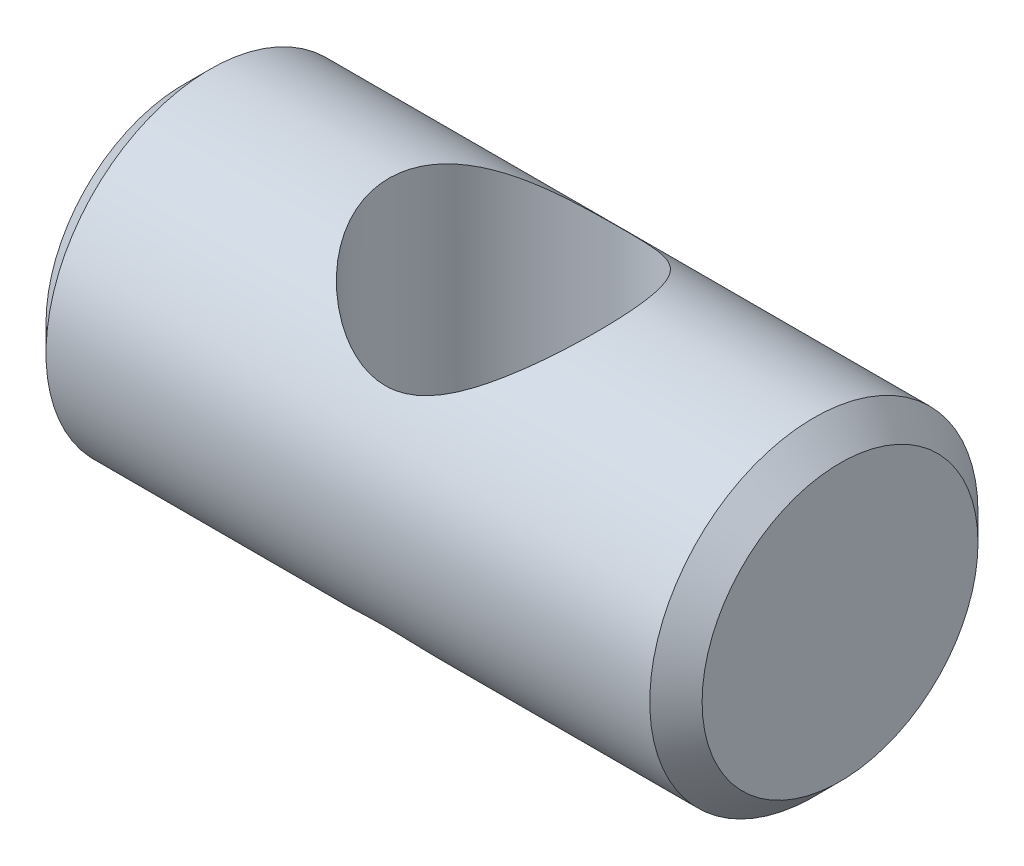
ISO-10303-21;
HEADER;
FILE_DESCRIPTION(('STEP AP214'),'2;1');
FILE_NAME('part.step','',(''),(''),'','','');
FILE_SCHEMA(('AUTOMOTIVE_DESIGN { 1 0 10303 214 1 1 1 1 }'));
ENDSEC;
DATA;
#1=APPLICATION_CONTEXT('core data for automotive mechanical design processes');
#2=APPLICATION_PROTOCOL_DEFINITION('international standard','automotive_design',2000,#1);
#3=PRODUCT_CONTEXT('',#1,'mechanical');
#4=PRODUCT('Part','Part','',(#3));
#5=PRODUCT_RELATED_PRODUCT_CATEGORY('part','',(#4));
#6=PRODUCT_DEFINITION_FORMATION('','',#4);
#7=PRODUCT_DEFINITION_CONTEXT('part definition',#1,'design');
#8=PRODUCT_DEFINITION('design','',#6,#7);
#9=PRODUCT_DEFINITION_SHAPE('','',#8);
#10=(LENGTH_UNIT() NAMED_UNIT(*) SI_UNIT(.MILLI.,.METRE.));
#11=(NAMED_UNIT(*) PLANE_ANGLE_UNIT() SI_UNIT($,.RADIAN.));
#12=(NAMED_UNIT(*) SI_UNIT($,.STERADIAN.) SOLID_ANGLE_UNIT());
#13=UNCERTAINTY_MEASURE_WITH_UNIT(LENGTH_MEASURE(1.E-05),#10,'distance_accuracy_value','');
#14=(GEOMETRIC_REPRESENTATION_CONTEXT(3) GLOBAL_UNCERTAINTY_ASSIGNED_CONTEXT((#13)) GLOBAL_UNIT_ASSIGNED_CONTEXT((#10,
#11,#12)) REPRESENTATION_CONTEXT('',''));
#15=CARTESIAN_POINT('',(0.,0.,0.));
#16=DIRECTION('',(0.,0.,1.));
#17=DIRECTION('',(1.,0.,0.));
#18=AXIS2_PLACEMENT_3D('',#15,#16,#17);
#19=CARTESIAN_POINT('',(9.525,0.,0.));
#20=DIRECTION('',(-1.,0.,0.));
#21=DIRECTION('',(0.,0.,1.));
#22=AXIS2_PLACEMENT_3D('',#19,#20,#21);
#23=CYLINDRICAL_SURFACE('',#22,4.765);
#24=CARTESIAN_POINT('',(0.,-3.0270158572429,3.68));
#25=CARTESIAN_POINT('',(0.0785672773316467,-3.02701614791727,3.67999984364138));
#26=CARTESIAN_POINT('',(0.157136135576355,-3.03031605642996,3.67729277636747));
#27=CARTESIAN_POINT('',(0.313369541449519,-3.04330147157753,3.66655295600809));
#28=CARTESIAN_POINT('',(0.391034010912772,-3.05298752605126,3.65851974601636));
#29=CARTESIAN_POINT('',(0.544942339151607,-3.07820352988238,3.63732812874269));
#30=CARTESIAN_POINT('',(0.621180877977563,-3.09375201630091,3.62415345944192));
#31=CARTESIAN_POINT('',(0.771468880528868,-3.12988210454059,3.59299821855179));
#32=CARTESIAN_POINT('',(0.845516665983408,-3.15046745848851,3.57501406328682));
#33=CARTESIAN_POINT('',(1.09433047382612,-3.22791462831319,3.50587087765695));
#34=CARTESIAN_POINT('',(1.26309282362243,-3.29483865802861,3.44382003292069));
#35=CARTESIAN_POINT('',(1.50370711041474,-3.40467601246938,3.33408533723918));
#36=CARTESIAN_POINT('',(1.58189244838755,-3.44290479326835,3.29468500807197));
#37=CARTESIAN_POINT('',(1.73423285237258,-3.52148653298939,3.21055545325705));
#38=CARTESIAN_POINT('',(1.80838881793449,-3.56183901380659,3.16582742418489));
#39=CARTESIAN_POINT('',(2.02850482582812,-3.68672600847629,3.02153691887044));
#40=CARTESIAN_POINT('',(2.16807869449588,-3.77315168849593,2.91372187409719));
#41=CARTESIAN_POINT('',(2.42959010373284,-3.94426933228633,2.67754924945123));
#42=CARTESIAN_POINT('',(2.55153658554773,-4.02896215617591,2.54920215427041));
#43=CARTESIAN_POINT('',(2.77693730786715,-4.19195052141121,2.27132648174837));
#44=CARTESIAN_POINT('',(2.88023478105728,-4.27018907543985,2.12163570850645));
#45=CARTESIAN_POINT('',(3.06369900830999,-4.41409842691617,1.80316374111448));
#46=CARTESIAN_POINT('',(3.14388622560065,-4.47978032533083,1.63439962117957));
#47=CARTESIAN_POINT('',(3.26635689009236,-4.58439476517905,1.30881127520956));
#48=CARTESIAN_POINT('',(3.3126324755552,-4.62591646772975,1.15433056577145));
#49=CARTESIAN_POINT('',(3.38325654959983,-4.69367027218436,0.83720228083025));
#50=CARTESIAN_POINT('',(3.40762001451853,-4.7199128126465,0.674560363681938));
#51=CARTESIAN_POINT('',(3.43267527752513,-4.75538994748078,0.345016918949483));
#52=CARTESIAN_POINT('',(3.43328564995364,-4.76456593536209,0.178102701594283));
#53=CARTESIAN_POINT('',(3.41018166140548,-4.76540378920208,-0.15408080850447));
#54=CARTESIAN_POINT('',(3.38646547727926,-4.75706434242047,-0.319349977022775));
#55=CARTESIAN_POINT('',(3.31775156953333,-4.72510260499364,-0.634317782486348));
#56=CARTESIAN_POINT('',(3.27397352746067,-4.70233080305011,-0.784375176401479));
#57=CARTESIAN_POINT('',(3.16750864597913,-4.64450941494238,-1.07505429218324));
#58=CARTESIAN_POINT('',(3.10481828431147,-4.60945754152293,-1.21567425043884));
#59=CARTESIAN_POINT('',(2.95652856255593,-4.52638674091888,-1.49677788855974));
#60=CARTESIAN_POINT('',(2.86942133720827,-4.47751111873768,-1.63620711351602));
#61=CARTESIAN_POINT('',(2.67788120319372,-4.37232420780869,-1.89951272145432));
#62=CARTESIAN_POINT('',(2.57343424063936,-4.31600689517522,-2.02337634423389));
#63=CARTESIAN_POINT('',(2.3299298971412,-4.18996971318213,-2.27426780979749));
#64=CARTESIAN_POINT('',(2.18800876851398,-4.11960732735628,-2.39819784816123));
#65=CARTESIAN_POINT('',(1.88505782163776,-3.98107848473248,-2.62174133186739));
#66=CARTESIAN_POINT('',(1.72402241690679,-3.91291267736107,-2.72134764203992));
#67=CARTESIAN_POINT('',(1.40961518716303,-3.79636450990898,-2.881168849186));
#68=CARTESIAN_POINT('',(1.25863725138285,-3.74654731116981,-2.94503209171547));
#69=CARTESIAN_POINT('',(0.945527440392473,-3.66060402226399,-3.05121747931762));
#70=CARTESIAN_POINT('',(0.783414037013451,-3.62445587601066,-3.09357436476774));
#71=CARTESIAN_POINT('',(0.533813056438611,-3.58476149841442,-3.13928376884266));
#72=CARTESIAN_POINT('',(0.449028547115522,-3.57393161480045,-3.15156761613341));
#73=CARTESIAN_POINT('',(0.278275024285709,-3.55780077117141,-3.16976872881678));
#74=CARTESIAN_POINT('',(0.192306660171831,-3.5524968934398,-3.17568935402606));
#75=CARTESIAN_POINT('',(0.0200327709043111,-3.54772147962291,-3.18102355866001));
#76=CARTESIAN_POINT('',(-0.0662726316081485,-3.54824798964232,-3.18043931801256));
#77=CARTESIAN_POINT('',(-0.238338872801629,-3.55508375410915,-3.17279435887041));
#78=CARTESIAN_POINT('',(-0.324099748085627,-3.56139261563451,-3.16573408043507));
#79=CARTESIAN_POINT('',(-0.553401842306177,-3.58576306843395,-3.13816835119393));
#80=CARTESIAN_POINT('',(-0.695739197403444,-3.60894237647337,-3.11173256017326));
#81=CARTESIAN_POINT('',(-0.973480788870411,-3.6678298405413,-3.04208625520151));
#82=CARTESIAN_POINT('',(-1.10887734054378,-3.70355155394913,-2.99885758403296));
#83=CARTESIAN_POINT('',(-1.42379146726814,-3.7997001514418,-2.87675019956371));
#84=CARTESIAN_POINT('',(-1.59919673865542,-3.86428769996493,-2.79052654374781));
#85=CARTESIAN_POINT('',(-1.93113815119942,-4.00059813210694,-2.59133845951309));
#86=CARTESIAN_POINT('',(-2.08764088718698,-4.07233325050109,-2.47832770642991));
#87=CARTESIAN_POINT('',(-2.38199709911893,-4.21579037939226,-2.22570370446708));
#88=CARTESIAN_POINT('',(-2.51955338419097,-4.28749766673045,-2.08573466326166));
#89=CARTESIAN_POINT('',(-2.77028243502778,-4.42234806198233,-1.78201502187867));
#90=CARTESIAN_POINT('',(-2.88349257282064,-4.48550424008068,-1.61830152645775));
#91=CARTESIAN_POINT('',(-3.06402610957439,-4.58658548395503,-1.30045140866569));
#92=CARTESIAN_POINT('',(-3.13591982023922,-4.62699541781642,-1.14970877890861));
#93=CARTESIAN_POINT('',(-3.25766051296821,-4.69370617156705,-0.836599849304391));
#94=CARTESIAN_POINT('',(-3.30752205037566,-4.7200163088041,-0.674241306034808));
#95=CARTESIAN_POINT('',(-3.3829870904449,-4.75572615385405,-0.341241432427484));
#96=CARTESIAN_POINT('',(-3.40846923089666,-4.7650414665297,-0.170563063438746));
#97=CARTESIAN_POINT('',(-3.4334390909829,-4.76495829995348,0.172677006169806));
#98=CARTESIAN_POINT('',(-3.43293306367628,-4.7555643228997,0.345238243758834));
#99=CARTESIAN_POINT('',(-3.40754400048731,-4.71998636563285,0.672126495727839));
#100=CARTESIAN_POINT('',(-3.38468468821344,-4.69525837988108,0.82677947345949));
#101=CARTESIAN_POINT('',(-3.31910619707247,-4.63193340521078,1.12882616508402));
#102=CARTESIAN_POINT('',(-3.27638180384756,-4.59333277548538,1.27621796175837));
#103=CARTESIAN_POINT('',(-3.17042951924722,-4.50215126554465,1.56862605724139));
#104=CARTESIAN_POINT('',(-3.10621371599284,-4.44892473542071,1.71307815224114));
#105=CARTESIAN_POINT('',(-2.96073945861412,-4.33272638873523,1.98874620073681));
#106=CARTESIAN_POINT('',(-2.87947919610232,-4.26975353829207,2.11996074756245));
#107=CARTESIAN_POINT('',(-2.68651050838254,-4.12556821291774,2.39003735747662));
#108=CARTESIAN_POINT('',(-2.57196063848181,-4.04309554925752,2.52618739114482));
#109=CARTESIAN_POINT('',(-2.32447412944917,-3.87408431941462,2.77844859407009));
#110=CARTESIAN_POINT('',(-2.19149095139184,-3.78753584009049,2.89450731580784));
#111=CARTESIAN_POINT('',(-1.96595276183287,-3.65130486353125,3.06263487303052));
#112=CARTESIAN_POINT('',(-1.87886470860019,-3.60090149373494,3.12157066922301));
#113=CARTESIAN_POINT('',(-1.69862262017005,-3.50236607543005,3.23173475735497));
#114=CARTESIAN_POINT('',(-1.60546616441238,-3.45423494663789,3.28295994638551));
#115=CARTESIAN_POINT('',(-1.41335402823624,-3.36225362869259,3.37709887635029));
#116=CARTESIAN_POINT('',(-1.31441341048655,-3.31839304937429,3.4200330530899));
#117=CARTESIAN_POINT('',(-1.11061583662532,-3.23713845030014,3.49704051581634));
#118=CARTESIAN_POINT('',(-1.00576424358737,-3.19973868995705,3.53112168161428));
#119=CARTESIAN_POINT('',(-0.826860618617421,-3.1451674862639,3.57966454279998));
#120=CARTESIAN_POINT('',(-0.754330914941616,-3.12542579098052,3.59686794878708));
#121=CARTESIAN_POINT('',(-0.607204587985837,-3.09080711138969,3.62665947956898));
#122=CARTESIAN_POINT('',(-0.532609008476299,-3.07592771737776,3.63924989089071));
#123=CARTESIAN_POINT('',(-0.382096659839412,-3.05181598122002,3.65949364139542));
#124=CARTESIAN_POINT('',(-0.306185151895194,-3.04256489437812,3.66716337327478));
#125=CARTESIAN_POINT('',(-0.153516252829605,-3.03016475948479,3.67741657137031));
#126=CARTESIAN_POINT('',(-0.0767588809019638,-3.02701557325904,3.68000015275969));
#127=CARTESIAN_POINT('',(0.,-3.0270158572429,3.68));
#128=B_SPLINE_CURVE_WITH_KNOTS('',3,(#24,#25,#26,#27,#28,#29,#30,#31,#32,#33,#34,#35,#36,#37,
#38,#39,#40,#41,#42,#43,#44,#45,#46,#47,#48,#49,#50,#51,#52,#53,#54,#55,#56,#57,#58,#59,#60,#61,
#62,#63,#64,#65,#66,#67,#68,#69,#70,#71,#72,#73,#74,#75,#76,#77,#78,#79,#80,#81,#82,#83,#84,#85,
#86,#87,#88,#89,#90,#91,#92,#93,#94,#95,#96,#97,#98,#99,#100,#101,#102,#103,#104,#105,#106,#107,
#108,#109,#110,#111,#112,#113,#114,#115,#116,#117,#118,#119,#120,#121,#122,#123,#124,#125,#126,
#127),.UNSPECIFIED.,.T.,.F.,(4,2,2,2,2,2,2,2,2,2,2,2,2,2,2,2,2,2,2,2,2,2,2,2,2,2,2,2,2,2,2,2,2,
2,2,2,2,2,2,2,2,2,2,2,2,2,2,2,2,2,2,4),(0.,0.235591708988227,0.471203630963839,
0.707566894291257,0.944106771258298,1.51591397043088,1.80236618274397,2.08875418016066,
2.67592975620557,3.26280644257577,3.85440755326201,4.44548320346413,4.94292664174491,
5.44002983205938,5.93883694376225,6.43768144120932,6.9095606777859,7.38152785217115,
7.89413675044232,8.40716316586385,9.00813916387887,9.60929124216605,10.1214610992978,
10.6328009675269,10.8914987801306,11.1500599316432,11.4085344360666,11.6669913779457,
12.1048085655684,12.5431004643862,13.1573710774192,13.7727118402267,14.3968121302921,
15.0199474601663,15.5333029695888,16.0463188267164,16.5618754223646,17.077307969612,
17.550023970907,18.0228641248864,18.5213957266873,19.0199802486027,19.6062313855034,
20.1939905554461,20.5434646283834,20.8930789631276,21.2418202453876,21.5902500511245,
21.8213124314337,22.0522601254179,22.2824343920731,22.5126034464923),.UNSPECIFIED.);
#129=CARTESIAN_POINT('',(0.,-3.0270158572429,3.68));
#130=VERTEX_POINT('',#129);
#131=EDGE_CURVE('E48',#130,#130,#128,.T.);
#132=ORIENTED_EDGE('',*,*,#131,.T.);
#133=EDGE_LOOP('',(#132));
#134=FACE_BOUND('',#133,.T.);
#135=CARTESIAN_POINT('',(0.,3.0270158572429,3.68));
#136=CARTESIAN_POINT('',(-0.0785672773316464,3.02701614791727,3.67999984364138));
#137=CARTESIAN_POINT('',(-0.157136135576355,3.03031605642997,3.67729277636747));
#138=CARTESIAN_POINT('',(-0.313369541449519,3.04330147157753,3.66655295600809));
#139=CARTESIAN_POINT('',(-0.391034010912771,3.05298752605126,3.65851974601636));
#140=CARTESIAN_POINT('',(-0.544942339151606,3.07820352988238,3.63732812874269));
#141=CARTESIAN_POINT('',(-0.621180877977561,3.09375201630091,3.62415345944192));
#142=CARTESIAN_POINT('',(-0.771468880528866,3.12988210454059,3.59299821855179));
#143=CARTESIAN_POINT('',(-0.845516665983406,3.15046745848851,3.57501406328682));
#144=CARTESIAN_POINT('',(-1.09433047382612,3.22791462831318,3.50587087765695));
#145=CARTESIAN_POINT('',(-1.26309282362243,3.2948386580286,3.44382003292069));
#146=CARTESIAN_POINT('',(-1.50370711041474,3.40467601246938,3.33408533723919));
#147=CARTESIAN_POINT('',(-1.58189244838754,3.44290479326835,3.29468500807198));
#148=CARTESIAN_POINT('',(-1.73423285237257,3.52148653298938,3.21055545325705));
#149=CARTESIAN_POINT('',(-1.80838881793448,3.56183901380659,3.16582742418489));
#150=CARTESIAN_POINT('',(-2.02850482582811,3.68672600847628,3.02153691887044));
#151=CARTESIAN_POINT('',(-2.16807869449587,3.77315168849593,2.9137218740972));
#152=CARTESIAN_POINT('',(-2.42959010373283,3.94426933228633,2.67754924945124));
#153=CARTESIAN_POINT('',(-2.55153658554772,4.0289621561759,2.54920215427042));
#154=CARTESIAN_POINT('',(-2.77693730786714,4.1919505214112,2.27132648174838));
#155=CARTESIAN_POINT('',(-2.88023478105728,4.27018907543984,2.12163570850646));
#156=CARTESIAN_POINT('',(-3.06369900830999,4.41409842691616,1.80316374111449));
#157=CARTESIAN_POINT('',(-3.14388622560065,4.47978032533083,1.63439962117958));
#158=CARTESIAN_POINT('',(-3.26635689009236,4.58439476517905,1.30881127520957));
#159=CARTESIAN_POINT('',(-3.3126324755552,4.62591646772974,1.15433056577145));
#160=CARTESIAN_POINT('',(-3.38325654959983,4.69367027218436,0.837202280830259));
#161=CARTESIAN_POINT('',(-3.40762001451853,4.71991281264649,0.674560363681946));
#162=CARTESIAN_POINT('',(-3.43267527752513,4.75538994748078,0.345016918949491));
#163=CARTESIAN_POINT('',(-3.43328564995364,4.76456593536209,0.17810270159429));
#164=CARTESIAN_POINT('',(-3.41018166140549,4.76540378920208,-0.154080808504463));
#165=CARTESIAN_POINT('',(-3.38646547727926,4.75706434242047,-0.319349977022769));
#166=CARTESIAN_POINT('',(-3.31775156953333,4.72510260499364,-0.634317782486342));
#167=CARTESIAN_POINT('',(-3.27397352746067,4.70233080305011,-0.784375176401474));
#168=CARTESIAN_POINT('',(-3.16750864597913,4.64450941494238,-1.07505429218324));
#169=CARTESIAN_POINT('',(-3.10481828431148,4.60945754152293,-1.21567425043883));
#170=CARTESIAN_POINT('',(-2.95652856255593,4.52638674091888,-1.49677788855974));
#171=CARTESIAN_POINT('',(-2.86942133720828,4.47751111873768,-1.63620711351601));
#172=CARTESIAN_POINT('',(-2.67788120319372,4.37232420780869,-1.89951272145431));
#173=CARTESIAN_POINT('',(-2.57343424063936,4.31600689517522,-2.02337634423388));
#174=CARTESIAN_POINT('',(-2.32992989714121,4.18996971318213,-2.27426780979749));
#175=CARTESIAN_POINT('',(-2.18800876851398,4.11960732735629,-2.39819784816122));
#176=CARTESIAN_POINT('',(-1.88505782163776,3.98107848473248,-2.62174133186739));
#177=CARTESIAN_POINT('',(-1.72402241690679,3.91291267736107,-2.72134764203992));
#178=CARTESIAN_POINT('',(-1.40961518716303,3.79636450990898,-2.881168849186));
#179=CARTESIAN_POINT('',(-1.25863725138286,3.74654731116981,-2.94503209171546));
#180=CARTESIAN_POINT('',(-0.945527440392479,3.66060402226399,-3.05121747931762));
#181=CARTESIAN_POINT('',(-0.783414037013456,3.62445587601066,-3.09357436476774));
#182=CARTESIAN_POINT('',(-0.533813056438615,3.58476149841442,-3.13928376884266));
#183=CARTESIAN_POINT('',(-0.449028547115527,3.57393161480045,-3.15156761613341));
#184=CARTESIAN_POINT('',(-0.278275024285713,3.55780077117141,-3.16976872881678));
#185=CARTESIAN_POINT('',(-0.192306660171836,3.5524968934398,-3.17568935402606));
#186=CARTESIAN_POINT('',(-0.020032770904317,3.54772147962291,-3.18102355866001));
#187=CARTESIAN_POINT('',(0.0662726316081425,3.54824798964232,-3.18043931801256));
#188=CARTESIAN_POINT('',(0.238338872801623,3.55508375410915,-3.17279435887041));
#189=CARTESIAN_POINT('',(0.324099748085622,3.56139261563451,-3.16573408043507));
#190=CARTESIAN_POINT('',(0.553401842306172,3.58576306843395,-3.13816835119393));
#191=CARTESIAN_POINT('',(0.695739197403439,3.60894237647337,-3.11173256017326));
#192=CARTESIAN_POINT('',(0.973480788870407,3.6678298405413,-3.04208625520151));
#193=CARTESIAN_POINT('',(1.10887734054378,3.70355155394912,-2.99885758403296));
#194=CARTESIAN_POINT('',(1.42379146726814,3.7997001514418,-2.87675019956372));
#195=CARTESIAN_POINT('',(1.59919673865541,3.86428769996493,-2.79052654374781));
#196=CARTESIAN_POINT('',(1.93113815119942,4.00059813210694,-2.59133845951309));
#197=CARTESIAN_POINT('',(2.08764088718698,4.07233325050109,-2.47832770642991));
#198=CARTESIAN_POINT('',(2.38199709911893,4.21579037939226,-2.22570370446708));
#199=CARTESIAN_POINT('',(2.51955338419097,4.28749766673045,-2.08573466326166));
#200=CARTESIAN_POINT('',(2.77028243502778,4.42234806198233,-1.78201502187868));
#201=CARTESIAN_POINT('',(2.88349257282064,4.48550424008068,-1.61830152645775));
#202=CARTESIAN_POINT('',(3.06402610957439,4.58658548395503,-1.30045140866569));
#203=CARTESIAN_POINT('',(3.13591982023922,4.62699541781642,-1.14970877890861));
#204=CARTESIAN_POINT('',(3.25766051296821,4.69370617156705,-0.836599849304392));
#205=CARTESIAN_POINT('',(3.30752205037566,4.7200163088041,-0.674241306034809));
#206=CARTESIAN_POINT('',(3.3829870904449,4.75572615385405,-0.341241432427484));
#207=CARTESIAN_POINT('',(3.40846923089666,4.7650414665297,-0.170563063438745));
#208=CARTESIAN_POINT('',(3.4334390909829,4.76495829995348,0.172677006169808));
#209=CARTESIAN_POINT('',(3.43293306367628,4.7555643228997,0.345238243758834));
#210=CARTESIAN_POINT('',(3.40754400048731,4.71998636563285,0.672126495727838));
#211=CARTESIAN_POINT('',(3.38468468821344,4.69525837988108,0.826779473459489));
#212=CARTESIAN_POINT('',(3.31910619707247,4.63193340521078,1.12882616508402));
#213=CARTESIAN_POINT('',(3.27638180384756,4.59333277548538,1.27621796175837));
#214=CARTESIAN_POINT('',(3.17042951924722,4.50215126554465,1.56862605724139));
#215=CARTESIAN_POINT('',(3.10621371599284,4.44892473542071,1.71307815224114));
#216=CARTESIAN_POINT('',(2.96073945861412,4.33272638873524,1.98874620073681));
#217=CARTESIAN_POINT('',(2.87947919610232,4.26975353829207,2.11996074756244));
#218=CARTESIAN_POINT('',(2.68651050838254,4.12556821291774,2.39003735747662));
#219=CARTESIAN_POINT('',(2.57196063848181,4.04309554925752,2.52618739114482));
#220=CARTESIAN_POINT('',(2.32447412944917,3.87408431941462,2.77844859407009));
#221=CARTESIAN_POINT('',(2.19149095139184,3.78753584009048,2.89450731580785));
#222=CARTESIAN_POINT('',(1.96595276183288,3.65130486353125,3.06263487303052));
#223=CARTESIAN_POINT('',(1.87886470860019,3.60090149373494,3.12157066922301));
#224=CARTESIAN_POINT('',(1.69862262017005,3.50236607543005,3.23173475735497));
#225=CARTESIAN_POINT('',(1.60546616441238,3.45423494663789,3.28295994638551));
#226=CARTESIAN_POINT('',(1.41335402823624,3.36225362869259,3.37709887635029));
#227=CARTESIAN_POINT('',(1.31441341048655,3.31839304937429,3.42003305308989));
#228=CARTESIAN_POINT('',(1.11061583662532,3.23713845030014,3.49704051581634));
#229=CARTESIAN_POINT('',(1.00576424358737,3.19973868995705,3.53112168161428));
#230=CARTESIAN_POINT('',(0.826860618617422,3.1451674862639,3.57966454279998));
#231=CARTESIAN_POINT('',(0.754330914941616,3.12542579098052,3.59686794878708));
#232=CARTESIAN_POINT('',(0.607204587985838,3.09080711138969,3.62665947956898));
#233=CARTESIAN_POINT('',(0.5326090084763,3.07592771737776,3.63924989089071));
#234=CARTESIAN_POINT('',(0.382096659839413,3.05181598122002,3.65949364139542));
#235=CARTESIAN_POINT('',(0.306185151895194,3.04256489437812,3.66716337327478));
#236=CARTESIAN_POINT('',(0.153516252829605,3.03016475948479,3.67741657137031));
#237=CARTESIAN_POINT('',(0.0767588809019638,3.02701557325904,3.68000015275969));
#238=CARTESIAN_POINT('',(0.,3.0270158572429,3.68));
#239=B_SPLINE_CURVE_WITH_KNOTS('',3,(#135,#136,#137,#138,#139,#140,#141,#142,#143,#144,#145,
#146,#147,#148,#149,#150,#151,#152,#153,#154,#155,#156,#157,#158,#159,#160,#161,#162,#163,#164,
#165,#166,#167,#168,#169,#170,#171,#172,#173,#174,#175,#176,#177,#178,#179,#180,#181,#182,#183,
#184,#185,#186,#187,#188,#189,#190,#191,#192,#193,#194,#195,#196,#197,#198,#199,#200,#201,#202,
#203,#204,#205,#206,#207,#208,#209,#210,#211,#212,#213,#214,#215,#216,#217,#218,#219,#220,#221,
#222,#223,#224,#225,#226,#227,#228,#229,#230,#231,#232,#233,#234,#235,#236,#237,#238),
.UNSPECIFIED.,.T.,.F.,(4,2,2,2,2,2,2,2,2,2,2,2,2,2,2,2,2,2,2,2,2,2,2,2,2,2,2,2,2,2,2,2,2,2,2,2,
2,2,2,2,2,2,2,2,2,2,2,2,2,2,2,4),(0.,0.235591708988226,0.471203630963838,0.707566894291255,
0.944106771258295,1.51591397043087,1.80236618274396,2.08875418016066,2.67592975620556,
3.26280644257576,3.854407553262,4.44548320346412,4.9429266417449,5.44002983205937,
5.93883694376224,6.43768144120931,6.9095606777859,7.38152785217115,7.89413675044232,
8.40716316586385,9.00813916387887,9.60929124216605,10.1214610992978,10.6328009675269,
10.8914987801306,11.1500599316432,11.4085344360666,11.6669913779457,12.1048085655684,
12.5431004643861,13.1573710774192,13.7727118402267,14.3968121302921,15.0199474601663,
15.5333029695888,16.0463188267164,16.5618754223646,17.077307969612,17.550023970907,
18.0228641248864,18.5213957266873,19.0199802486027,19.6062313855034,20.1939905554461,
20.5434646283834,20.8930789631276,21.2418202453876,21.5902500511245,21.8213124314337,
22.0522601254179,22.2824343920731,22.5126034464923),.UNSPECIFIED.);
#240=CARTESIAN_POINT('',(0.,3.0270158572429,3.68));
#241=VERTEX_POINT('',#240);
#242=EDGE_CURVE('E67',#241,#241,#239,.T.);
#243=ORIENTED_EDGE('',*,*,#242,.T.);
#244=EDGE_LOOP('',(#243));
#245=FACE_BOUND('',#244,.T.);
#246=CARTESIAN_POINT('',(-8.76499999999999,0.,0.));
#247=DIRECTION('',(1.,0.,0.));
#248=DIRECTION('',(0.,0.,-1.));
#249=AXIS2_PLACEMENT_3D('',#246,#247,#248);
#250=CIRCLE('',#249,4.765);
#251=CARTESIAN_POINT('',(-8.76499999999999,0.,-4.765));
#252=VERTEX_POINT('',#251);
#253=EDGE_CURVE('E64',#252,#252,#250,.T.);
#254=ORIENTED_EDGE('',*,*,#253,.T.);
#255=EDGE_LOOP('',(#254));
#256=FACE_BOUND('',#255,.T.);
#257=CARTESIAN_POINT('',(8.76500000000001,0.,0.));
#258=DIRECTION('',(1.,0.,0.));
#259=DIRECTION('',(0.,0.,-1.));
#260=AXIS2_PLACEMENT_3D('',#257,#258,#259);
#261=CIRCLE('',#260,4.765);
#262=CARTESIAN_POINT('',(8.76500000000001,0.,-4.765));
#263=VERTEX_POINT('',#262);
#264=EDGE_CURVE('E105',#263,#263,#261,.F.);
#265=ORIENTED_EDGE('',*,*,#264,.T.);
#266=EDGE_LOOP('',(#265));
#267=FACE_BOUND('',#266,.T.);
#268=ADVANCED_FACE('F43',(#134,#245,#256,#267),#23,.T.);
#269=CARTESIAN_POINT('',(9.525,0.,0.));
#270=DIRECTION('',(1.,0.,0.));
#271=DIRECTION('',(0.,0.,-1.));
#272=AXIS2_PLACEMENT_3D('',#269,#270,#271);
#273=PLANE('',#272);
#274=CARTESIAN_POINT('',(9.525,0.,0.));
#275=DIRECTION('',(1.,0.,0.));
#276=DIRECTION('',(0.,0.,-1.));
#277=AXIS2_PLACEMENT_3D('',#274,#275,#276);
#278=CIRCLE('',#277,4.00500000000001);
#279=CARTESIAN_POINT('',(9.525,0.,-4.00500000000001));
#280=VERTEX_POINT('',#279);
#281=EDGE_CURVE('E10',#280,#280,#278,.T.);
#282=ORIENTED_EDGE('',*,*,#281,.T.);
#283=EDGE_LOOP('',(#282));
#284=FACE_BOUND('',#283,.T.);
#285=ADVANCED_FACE('F80',(#284),#273,.T.);
#286=CARTESIAN_POINT('',(-9.525,0.,0.));
#287=DIRECTION('',(1.,0.,0.));
#288=DIRECTION('',(0.,0.,-1.));
#289=AXIS2_PLACEMENT_3D('',#286,#287,#288);
#290=PLANE('',#289);
#291=CARTESIAN_POINT('',(-9.525,0.,0.));
#292=DIRECTION('',(1.,0.,0.));
#293=DIRECTION('',(0.,0.,-1.));
#294=AXIS2_PLACEMENT_3D('',#291,#292,#293);
#295=CIRCLE('',#294,4.00499999999998);
#296=CARTESIAN_POINT('',(-9.525,0.,-4.00499999999998));
#297=VERTEX_POINT('',#296);
#298=EDGE_CURVE('E58',#297,#297,#295,.F.);
#299=ORIENTED_EDGE('',*,*,#298,.T.);
#300=EDGE_LOOP('',(#299));
#301=FACE_BOUND('',#300,.T.);
#302=ADVANCED_FACE('F83',(#301),#290,.F.);
#303=CARTESIAN_POINT('',(-8.76499999999999,0.,0.));
#304=DIRECTION('',(1.,0.,0.));
#305=DIRECTION('',(0.,0.,-1.));
#306=AXIS2_PLACEMENT_3D('',#303,#304,#305);
#307=CONICAL_SURFACE('',#306,4.765,0.785398163397451);
#308=ORIENTED_EDGE('',*,*,#298,.F.);
#309=EDGE_LOOP('',(#308));
#310=FACE_BOUND('',#309,.T.);
#311=ORIENTED_EDGE('',*,*,#253,.F.);
#312=EDGE_LOOP('',(#311));
#313=FACE_BOUND('',#312,.T.);
#314=ADVANCED_FACE('F85',(#310,#313),#307,.T.);
#315=CARTESIAN_POINT('',(9.525,0.,0.));
#316=DIRECTION('',(-1.,0.,0.));
#317=DIRECTION('',(0.,0.,1.));
#318=AXIS2_PLACEMENT_3D('',#315,#316,#317);
#319=CONICAL_SURFACE('',#318,4.00500000000001,0.785398163397448);
#320=ORIENTED_EDGE('',*,*,#264,.F.);
#321=EDGE_LOOP('',(#320));
#322=FACE_BOUND('',#321,.T.);
#323=ORIENTED_EDGE('',*,*,#281,.F.);
#324=EDGE_LOOP('',(#323));
#325=FACE_BOUND('',#324,.T.);
#326=ADVANCED_FACE('F46',(#322,#325),#319,.T.);
#327=CARTESIAN_POINT('',(0.,-9.525,0.25));
#328=DIRECTION('',(0.,1.,0.));
#329=DIRECTION('',(0.,0.,1.));
#330=AXIS2_PLACEMENT_3D('',#327,#328,#329);
#331=CYLINDRICAL_SURFACE('',#330,3.43);
#332=ORIENTED_EDGE('',*,*,#242,.F.);
#333=EDGE_LOOP('',(#332));
#334=FACE_BOUND('',#333,.T.);
#335=ORIENTED_EDGE('',*,*,#131,.F.);
#336=EDGE_LOOP('',(#335));
#337=FACE_BOUND('',#336,.T.);
#338=ADVANCED_FACE('F75',(#334,#337),#331,.F.);
#339=CLOSED_SHELL('',(#268,#285,#302,#314,#326,#338));
#340=MANIFOLD_SOLID_BREP('B2',#339);
#341=ADVANCED_BREP_SHAPE_REPRESENTATION('',(#18,#340),#14);
#342=SHAPE_DEFINITION_REPRESENTATION(#9,#341);
ENDSEC;
END-ISO-10303-21;
